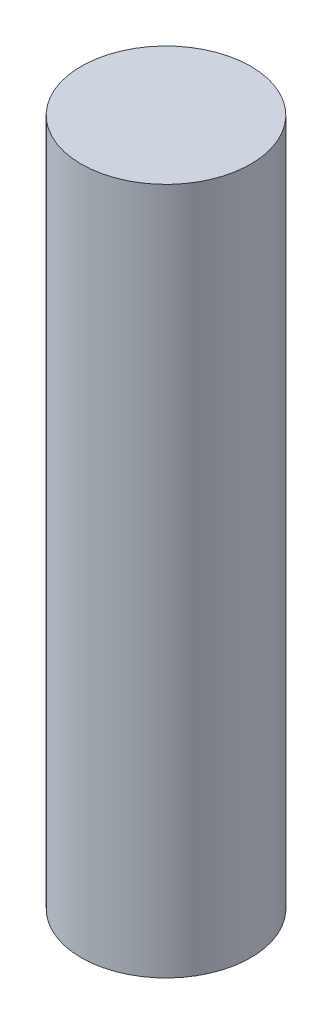
ISO-10303-21;
HEADER;
FILE_DESCRIPTION(('STEP AP214'),'2;1');
FILE_NAME('part.step','',(''),(''),'','','');
FILE_SCHEMA(('AUTOMOTIVE_DESIGN { 1 0 10303 214 1 1 1 1 }'));
ENDSEC;
DATA;
#1=APPLICATION_CONTEXT('core data for automotive mechanical design processes');
#2=APPLICATION_PROTOCOL_DEFINITION('international standard','automotive_design',2000,#1);
#3=PRODUCT_CONTEXT('',#1,'mechanical');
#4=PRODUCT('Part','Part','',(#3));
#5=PRODUCT_RELATED_PRODUCT_CATEGORY('part','',(#4));
#6=PRODUCT_DEFINITION_FORMATION('','',#4);
#7=PRODUCT_DEFINITION_CONTEXT('part definition',#1,'design');
#8=PRODUCT_DEFINITION('design','',#6,#7);
#9=PRODUCT_DEFINITION_SHAPE('','',#8);
#10=(LENGTH_UNIT() NAMED_UNIT(*) SI_UNIT(.MILLI.,.METRE.));
#11=(NAMED_UNIT(*) PLANE_ANGLE_UNIT() SI_UNIT($,.RADIAN.));
#12=(NAMED_UNIT(*) SI_UNIT($,.STERADIAN.) SOLID_ANGLE_UNIT());
#13=UNCERTAINTY_MEASURE_WITH_UNIT(LENGTH_MEASURE(1.E-05),#10,'distance_accuracy_value','');
#14=(GEOMETRIC_REPRESENTATION_CONTEXT(3) GLOBAL_UNCERTAINTY_ASSIGNED_CONTEXT((#13)) GLOBAL_UNIT_ASSIGNED_CONTEXT((#10,
#11,#12)) REPRESENTATION_CONTEXT('',''));
#15=CARTESIAN_POINT('',(0.,0.,0.));
#16=DIRECTION('',(0.,0.,1.));
#17=DIRECTION('',(1.,0.,0.));
#18=AXIS2_PLACEMENT_3D('',#15,#16,#17);
#19=CARTESIAN_POINT('',(0.,300.,0.));
#20=DIRECTION('',(0.,-1.,0.));
#21=DIRECTION('',(0.,0.,-1.));
#22=AXIS2_PLACEMENT_3D('',#19,#20,#21);
#23=CYLINDRICAL_SURFACE('',#22,37.);
#24=CARTESIAN_POINT('',(0.,300.,0.));
#25=DIRECTION('',(0.,1.,0.));
#26=DIRECTION('',(0.,0.,1.));
#27=AXIS2_PLACEMENT_3D('',#24,#25,#26);
#28=CIRCLE('',#27,37.);
#29=CARTESIAN_POINT('',(0.,300.,37.));
#30=VERTEX_POINT('',#29);
#31=EDGE_CURVE('E10',#30,#30,#28,.T.);
#32=ORIENTED_EDGE('',*,*,#31,.F.);
#33=EDGE_LOOP('',(#32));
#34=FACE_BOUND('',#33,.T.);
#35=CARTESIAN_POINT('',(0.,0.,0.));
#36=DIRECTION('',(0.,1.,0.));
#37=DIRECTION('',(0.,0.,1.));
#38=AXIS2_PLACEMENT_3D('',#35,#36,#37);
#39=CIRCLE('',#38,37.);
#40=CARTESIAN_POINT('',(0.,0.,37.));
#41=VERTEX_POINT('',#40);
#42=EDGE_CURVE('E44',#41,#41,#39,.T.);
#43=ORIENTED_EDGE('',*,*,#42,.T.);
#44=EDGE_LOOP('',(#43));
#45=FACE_BOUND('',#44,.T.);
#46=ADVANCED_FACE('F41',(#34,#45),#23,.T.);
#47=CARTESIAN_POINT('',(0.,300.,0.));
#48=DIRECTION('',(0.,1.,0.));
#49=DIRECTION('',(0.,0.,1.));
#50=AXIS2_PLACEMENT_3D('',#47,#48,#49);
#51=PLANE('',#50);
#52=ORIENTED_EDGE('',*,*,#31,.T.);
#53=EDGE_LOOP('',(#52));
#54=FACE_BOUND('',#53,.T.);
#55=ADVANCED_FACE('F58',(#54),#51,.T.);
#56=CARTESIAN_POINT('',(0.,0.,0.));
#57=DIRECTION('',(0.,1.,0.));
#58=DIRECTION('',(0.,0.,1.));
#59=AXIS2_PLACEMENT_3D('',#56,#57,#58);
#60=PLANE('',#59);
#61=ORIENTED_EDGE('',*,*,#42,.F.);
#62=EDGE_LOOP('',(#61));
#63=FACE_BOUND('',#62,.T.);
#64=ADVANCED_FACE('F56',(#63),#60,.F.);
#65=CLOSED_SHELL('',(#46,#55,#64));
#66=MANIFOLD_SOLID_BREP('B2',#65);
#67=ADVANCED_BREP_SHAPE_REPRESENTATION('',(#18,#66),#14);
#68=SHAPE_DEFINITION_REPRESENTATION(#9,#67);
ENDSEC;
END-ISO-10303-21;
